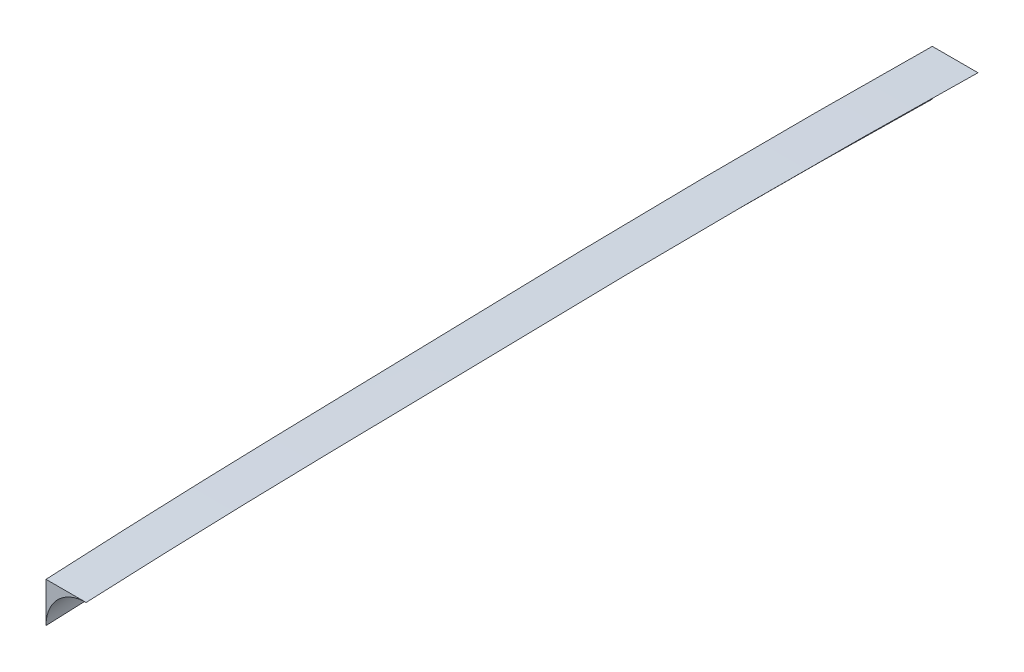
ISO-10303-21;
HEADER;
FILE_DESCRIPTION(('STEP AP214'),'2;1');
FILE_NAME('part.step','',(''),(''),'','','');
FILE_SCHEMA(('AUTOMOTIVE_DESIGN { 1 0 10303 214 1 1 1 1 }'));
ENDSEC;
DATA;
#1=APPLICATION_CONTEXT('core data for automotive mechanical design processes');
#2=APPLICATION_PROTOCOL_DEFINITION('international standard','automotive_design',2000,#1);
#3=PRODUCT_CONTEXT('',#1,'mechanical');
#4=PRODUCT('Part','Part','',(#3));
#5=PRODUCT_RELATED_PRODUCT_CATEGORY('part','',(#4));
#6=PRODUCT_DEFINITION_FORMATION('','',#4);
#7=PRODUCT_DEFINITION_CONTEXT('part definition',#1,'design');
#8=PRODUCT_DEFINITION('design','',#6,#7);
#9=PRODUCT_DEFINITION_SHAPE('','',#8);
#10=(LENGTH_UNIT() NAMED_UNIT(*) SI_UNIT(.MILLI.,.METRE.));
#11=(NAMED_UNIT(*) PLANE_ANGLE_UNIT() SI_UNIT($,.RADIAN.));
#12=(NAMED_UNIT(*) SI_UNIT($,.STERADIAN.) SOLID_ANGLE_UNIT());
#13=UNCERTAINTY_MEASURE_WITH_UNIT(LENGTH_MEASURE(1.E-05),#10,'distance_accuracy_value','');
#14=(GEOMETRIC_REPRESENTATION_CONTEXT(3) GLOBAL_UNCERTAINTY_ASSIGNED_CONTEXT((#13)) GLOBAL_UNIT_ASSIGNED_CONTEXT((#10,
#11,#12)) REPRESENTATION_CONTEXT('',''));
#15=CARTESIAN_POINT('',(0.,0.,0.));
#16=DIRECTION('',(0.,0.,1.));
#17=DIRECTION('',(1.,0.,0.));
#18=AXIS2_PLACEMENT_3D('',#15,#16,#17);
#19=CARTESIAN_POINT('',(536.645794558048,125.088293831377,1478.12000003458));
#20=DIRECTION('',(0.,0.,1.));
#21=DIRECTION('',(-1.,0.,0.));
#22=AXIS2_PLACEMENT_3D('',#19,#20,#21);
#23=PLANE('',#22);
#24=CARTESIAN_POINT('',(469.721789204401,192.012299185025,1478.12000003458));
#25=CARTESIAN_POINT('',(475.298789650539,192.012299185025,1478.12000003458));
#26=CARTESIAN_POINT('',(486.452790542813,192.012299185025,1478.12000003458));
#27=CARTESIAN_POINT('',(503.183791881225,192.012299185025,1478.12000003458));
#28=CARTESIAN_POINT('',(519.914793219637,192.012299185025,1478.12000003458));
#29=CARTESIAN_POINT('',(531.068794111911,192.012299185025,1478.12000003458));
#30=CARTESIAN_POINT('',(536.645794558048,192.012299185025,1478.12000003458));
#31=B_SPLINE_CURVE_WITH_KNOTS('',3,(#24,#25,#26,#27,#28,#29,#30),.UNSPECIFIED.,.F.,.F.,(4,1,1,1,
4),(0.719950423244221,0.789962817433166,0.859975211622111,0.929987605811055,1.),.UNSPECIFIED.);
#32=CARTESIAN_POINT('',(469.721789204401,192.012299185025,1478.12000003458));
#33=VERTEX_POINT('',#32);
#34=CARTESIAN_POINT('',(536.645794558048,192.012299185025,1478.12000003458));
#35=VERTEX_POINT('',#34);
#36=EDGE_CURVE('E173',#33,#35,#31,.T.);
#37=ORIENTED_EDGE('',*,*,#36,.F.);
#38=CARTESIAN_POINT('',(469.721789204401,125.088293831377,1478.12000003458));
#39=DIRECTION('',(0.,1.,0.));
#40=VECTOR('',#39,1.);
#41=LINE('',#38,#40);
#42=CARTESIAN_POINT('',(469.721789204401,125.088293831377,1478.12000003458));
#43=VERTEX_POINT('',#42);
#44=EDGE_CURVE('E12',#43,#33,#41,.T.);
#45=ORIENTED_EDGE('',*,*,#44,.F.);
#46=CARTESIAN_POINT('',(536.645794558048,192.012299185025,1478.12000003458));
#47=CARTESIAN_POINT('',(532.265628678885,192.012299185025,1478.12000003458));
#48=CARTESIAN_POINT('',(523.505401537646,191.149739728319,1478.12000003458));
#49=CARTESIAN_POINT('',(510.86993768225,187.316653797916,1478.12000003457));
#50=CARTESIAN_POINT('',(499.225054669449,181.092417477664,1478.12000003458));
#51=CARTESIAN_POINT('',(489.018240720654,172.715847668771,1478.12000003458));
#52=CARTESIAN_POINT('',(480.641670911763,162.509033719978,1478.12000003458));
#53=CARTESIAN_POINT('',(474.417434591509,150.864150707175,1478.12000003458));
#54=CARTESIAN_POINT('',(470.584348661108,138.228686851781,1478.12000003458));
#55=CARTESIAN_POINT('',(469.721789204401,129.46845971054,1478.12000003458));
#56=CARTESIAN_POINT('',(469.721789204401,125.088293831377,1478.12000003458));
#57=B_SPLINE_CURVE_WITH_KNOTS('',3,(#46,#47,#48,#49,#50,#51,#52,#53,#54,#55,#56),.UNSPECIFIED.,
.F.,.F.,(4,1,1,1,1,1,1,1,4),(0.,0.0549876058110553,0.109975211622111,0.164962817433166,
0.219950423244221,0.274938029055277,0.329925634866332,0.384913240677387,0.439900846488443),.UNSPECIFIED.);
#58=EDGE_CURVE('E70',#35,#43,#57,.T.);
#59=ORIENTED_EDGE('',*,*,#58,.F.);
#60=EDGE_LOOP('',(#37,#45,#59));
#61=FACE_BOUND('',#60,.T.);
#62=ADVANCED_FACE('F59',(#61),#23,.T.);
#63=CARTESIAN_POINT('',(545.921789204401,146.514247855733,0.));
#64=DIRECTION('',(0.,0.,-1.));
#65=DIRECTION('',(1.,0.,0.));
#66=AXIS2_PLACEMENT_3D('',#63,#64,#65);
#67=PLANE('',#66);
#68=CARTESIAN_POINT('',(469.721789204401,146.514247855734,0.));
#69=CARTESIAN_POINT('',(469.721789204401,151.501526160857,0.));
#70=CARTESIAN_POINT('',(470.703903622893,161.475963653578,0.));
#71=CARTESIAN_POINT('',(475.068274021124,175.862764633185,0.));
#72=CARTESIAN_POINT('',(482.155219954757,189.121685417836,0.));
#73=CARTESIAN_POINT('',(491.692823331371,200.743213728763,0.));
#74=CARTESIAN_POINT('',(503.3143516423,210.280817105379,0.));
#75=CARTESIAN_POINT('',(516.57327242695,217.367763039009,0.));
#76=CARTESIAN_POINT('',(530.960073406556,221.732133437242,0.));
#77=CARTESIAN_POINT('',(540.934510899278,222.714247855734,0.));
#78=CARTESIAN_POINT('',(545.921789204401,222.714247855734,0.));
#79=B_SPLINE_CURVE_WITH_KNOTS('',3,(#68,#69,#70,#71,#72,#73,#74,#75,#76,#77,#78),.UNSPECIFIED.,
.F.,.F.,(4,1,1,1,1,1,1,1,4),(0.,0.0549876058110552,0.109975211622111,0.164962817433166,
0.219950423244221,0.274938029055277,0.329925634866332,0.384913240677387,0.439900846488443),.UNSPECIFIED.);
#80=CARTESIAN_POINT('',(469.721789204401,146.514247855733,0.));
#81=VERTEX_POINT('',#80);
#82=CARTESIAN_POINT('',(545.921789204401,222.714247855733,0.));
#83=VERTEX_POINT('',#82);
#84=EDGE_CURVE('E112',#81,#83,#79,.T.);
#85=ORIENTED_EDGE('',*,*,#84,.F.);
#86=CARTESIAN_POINT('',(469.721789204401,222.714247855733,0.));
#87=DIRECTION('',(0.,-1.,0.));
#88=VECTOR('',#87,1.);
#89=LINE('',#86,#88);
#90=CARTESIAN_POINT('',(469.721789204401,222.714247855733,0.));
#91=VERTEX_POINT('',#90);
#92=EDGE_CURVE('E95',#91,#81,#89,.T.);
#93=ORIENTED_EDGE('',*,*,#92,.F.);
#94=CARTESIAN_POINT('',(545.921789204401,222.714247855734,0.));
#95=CARTESIAN_POINT('',(539.571789204401,222.714247855733,0.));
#96=CARTESIAN_POINT('',(526.871789204402,222.714247855733,0.));
#97=CARTESIAN_POINT('',(507.8217892044,222.714247855734,0.));
#98=CARTESIAN_POINT('',(488.771789204402,222.714247855733,0.));
#99=CARTESIAN_POINT('',(476.071789204401,222.714247855733,0.));
#100=CARTESIAN_POINT('',(469.721789204401,222.714247855733,0.));
#101=B_SPLINE_CURVE_WITH_KNOTS('',3,(#94,#95,#96,#97,#98,#99,#100),.UNSPECIFIED.,.F.,.F.,(4,1,1,
1,4),(0.719950423244221,0.789962817433166,0.859975211622111,0.929987605811055,1.),.UNSPECIFIED.);
#102=EDGE_CURVE('E103',#83,#91,#101,.T.);
#103=ORIENTED_EDGE('',*,*,#102,.F.);
#104=EDGE_LOOP('',(#85,#93,#103));
#105=FACE_BOUND('',#104,.T.);
#106=ADVANCED_FACE('F111',(#105),#67,.T.);
#107=CARTESIAN_POINT('',(469.721789204401,222.714247855733,0.));
#108=CARTESIAN_POINT('',(469.721789204401,223.250393289315,39.964111836307));
#109=CARTESIAN_POINT('',(469.721789204401,223.877067278874,104.420155124772));
#110=CARTESIAN_POINT('',(469.721789204401,224.323472801892,210.525069486874));
#111=CARTESIAN_POINT('',(469.721789204401,224.146375677718,305.191546115832));
#112=CARTESIAN_POINT('',(469.721789204401,223.43436307838,394.789705875396));
#113=CARTESIAN_POINT('',(469.721789204401,222.58870705541,464.532982866826));
#114=CARTESIAN_POINT('',(469.721789204401,221.479454929101,534.202341779117));
#115=CARTESIAN_POINT('',(469.721789204401,220.123152326283,601.600090763413));
#116=CARTESIAN_POINT('',(469.721789204401,219.00813066391,647.56138222553));
#117=CARTESIAN_POINT('',(469.7217892044,214.748999567608,810.211036736476));
#118=CARTESIAN_POINT('',(469.7217892044,211.107532041842,949.273071124735));
#119=CARTESIAN_POINT('',(469.721789204401,206.746151266315,1115.82748334902));
#120=CARTESIAN_POINT('',(469.721789204401,205.186407442081,1169.8284689647));
#121=CARTESIAN_POINT('',(469.721789204401,202.431481829042,1249.5666113323));
#122=CARTESIAN_POINT('',(469.721789204401,199.146712327731,1331.11260801738));
#123=CARTESIAN_POINT('',(469.721789204401,195.646698573,1407.81553559688));
#124=CARTESIAN_POINT('',(469.721789204401,193.188798117387,1456.17907159136));
#125=CARTESIAN_POINT('',(469.721789204401,192.012299185025,1478.12000003458));
#126=CARTESIAN_POINT('',(476.071789204401,222.714247855733,0.));
#127=CARTESIAN_POINT('',(476.050733530523,223.250393289315,39.964111836307));
#128=CARTESIAN_POINT('',(476.017552718902,223.877067278874,104.420155124772));
#129=CARTESIAN_POINT('',(475.960121631796,224.323472801892,210.525069486874));
#130=CARTESIAN_POINT('',(475.911621080826,224.146375677718,305.191546115832));
#131=CARTESIAN_POINT('',(475.863120529856,223.43436307838,394.789705875396));
#132=CARTESIAN_POINT('',(475.826745116628,222.58870705541,464.532982866826));
#133=CARTESIAN_POINT('',(475.7903697034,221.479454929101,534.202341779117));
#134=CARTESIAN_POINT('',(475.753994290173,220.123152326283,601.600090763414));
#135=CARTESIAN_POINT('',(475.729744014688,219.00813066391,647.56138222553));
#136=CARTESIAN_POINT('',(475.646134500269,214.748999567608,810.211036736477));
#137=CARTESIAN_POINT('',(475.574650123594,211.107532041842,949.273071124736));
#138=CARTESIAN_POINT('',(475.48903338145,206.746151266315,1115.82748334902));
#139=CARTESIAN_POINT('',(475.460768650511,205.186407442081,1169.8284689647));
#140=CARTESIAN_POINT('',(475.418371554102,202.431481829042,1249.5666113323));
#141=CARTESIAN_POINT('',(475.375974457693,199.146712327731,1331.11260801738));
#142=CARTESIAN_POINT('',(475.336113823172,195.646698573,1407.81553559688));
#143=CARTESIAN_POINT('',(475.310385554121,193.188798117387,1456.17907159136));
#144=CARTESIAN_POINT('',(475.298789650539,192.012299185025,1478.12000003458));
#145=CARTESIAN_POINT('',(488.771789204402,222.714247855733,0.));
#146=CARTESIAN_POINT('',(488.708622182767,223.250393289315,39.964111836307));
#147=CARTESIAN_POINT('',(488.609079747905,223.877067278874,104.420155124772));
#148=CARTESIAN_POINT('',(488.436786486587,224.323472801892,210.525069486875));
#149=CARTESIAN_POINT('',(488.291284833676,224.146375677717,305.191546115832));
#150=CARTESIAN_POINT('',(488.145783180766,223.43436307838,394.789705875396));
#151=CARTESIAN_POINT('',(488.036656941082,222.58870705541,464.532982866826));
#152=CARTESIAN_POINT('',(487.927530701399,221.479454929101,534.202341779117));
#153=CARTESIAN_POINT('',(487.818404461716,220.123152326283,601.600090763414));
#154=CARTESIAN_POINT('',(487.745653635261,219.00813066391,647.561382225531));
#155=CARTESIAN_POINT('',(487.494825092006,214.748999567608,810.211036736477));
#156=CARTESIAN_POINT('',(487.280371961982,211.107532041841,949.273071124736));
#157=CARTESIAN_POINT('',(487.023521735548,206.746151266315,1115.82748334902));
#158=CARTESIAN_POINT('',(486.93872754273,205.186407442081,1169.82846896471));
#159=CARTESIAN_POINT('',(486.811536253504,202.431481829042,1249.5666113323));
#160=CARTESIAN_POINT('',(486.684344964277,199.146712327731,1331.11260801738));
#161=CARTESIAN_POINT('',(486.564763060714,195.646698573,1407.81553559688));
#162=CARTESIAN_POINT('',(486.487578253559,193.188798117387,1456.17907159137));
#163=CARTESIAN_POINT('',(486.452790542813,192.012299185025,1478.12000003458));
#164=CARTESIAN_POINT('',(507.8217892044,222.714247855734,0.));
#165=CARTESIAN_POINT('',(507.69545516113,223.250393289315,39.964111836307));
#166=CARTESIAN_POINT('',(507.496370291406,223.877067278875,104.420155124772));
#167=CARTESIAN_POINT('',(507.15178376877,224.323472801892,210.525069486874));
#168=CARTESIAN_POINT('',(506.860780462948,224.146375677718,305.191546115832));
#169=CARTESIAN_POINT('',(506.569777157128,223.43436307838,394.789705875396));
#170=CARTESIAN_POINT('',(506.351524677761,222.58870705541,464.532982866826));
#171=CARTESIAN_POINT('',(506.133272198395,221.479454929101,534.202341779117));
#172=CARTESIAN_POINT('',(505.915019719029,220.123152326283,601.600090763413));
#173=CARTESIAN_POINT('',(505.769518066118,219.00813066391,647.56138222553));
#174=CARTESIAN_POINT('',(505.267860979611,214.748999567608,810.211036736476));
#175=CARTESIAN_POINT('',(504.838954719562,211.107532041842,949.273071124735));
#176=CARTESIAN_POINT('',(504.325254266695,206.746151266315,1115.82748334902));
#177=CARTESIAN_POINT('',(504.155665881059,205.186407442081,1169.8284689647));
#178=CARTESIAN_POINT('',(503.901283302606,202.431481829042,1249.5666113323));
#179=CARTESIAN_POINT('',(503.646900724153,199.146712327731,1331.11260801738));
#180=CARTESIAN_POINT('',(503.407736917026,195.646698573,1407.81553559688));
#181=CARTESIAN_POINT('',(503.253367302717,193.188798117387,1456.17907159136));
#182=CARTESIAN_POINT('',(503.183791881225,192.012299185025,1478.12000003458));
#183=CARTESIAN_POINT('',(526.871789204402,222.714247855733,0.));
#184=CARTESIAN_POINT('',(526.682288139497,223.250393289315,39.964111836307));
#185=CARTESIAN_POINT('',(526.38366083491,223.877067278874,104.420155124772));
#186=CARTESIAN_POINT('',(525.866781050956,224.323472801892,210.525069486874));
#187=CARTESIAN_POINT('',(525.430276092224,224.146375677717,305.191546115832));
#188=CARTESIAN_POINT('',(524.993771133492,223.43436307838,394.789705875396));
#189=CARTESIAN_POINT('',(524.666392414442,222.58870705541,464.532982866826));
#190=CARTESIAN_POINT('',(524.339013695393,221.479454929101,534.202341779117));
#191=CARTESIAN_POINT('',(524.011634976344,220.123152326283,601.600090763414));
#192=CARTESIAN_POINT('',(523.793382496978,219.00813066391,647.56138222553));
#193=CARTESIAN_POINT('',(523.040896867218,214.748999567608,810.211036736477));
#194=CARTESIAN_POINT('',(522.397537477143,211.107532041841,949.273071124736));
#195=CARTESIAN_POINT('',(521.626986797842,206.746151266315,1115.82748334902));
#196=CARTESIAN_POINT('',(521.372604219388,205.186407442081,1169.8284689647));
#197=CARTESIAN_POINT('',(520.991030351708,202.431481829042,1249.5666113323));
#198=CARTESIAN_POINT('',(520.609456484029,199.146712327731,1331.11260801738));
#199=CARTESIAN_POINT('',(520.250710773338,195.646698573,1407.81553559688));
#200=CARTESIAN_POINT('',(520.019156351874,193.188798117387,1456.17907159137));
#201=CARTESIAN_POINT('',(519.914793219637,192.012299185025,1478.12000003458));
#202=CARTESIAN_POINT('',(539.571789204401,222.714247855733,0.));
#203=CARTESIAN_POINT('',(539.34017679174,223.250393289315,39.964111836307));
#204=CARTESIAN_POINT('',(538.975187863911,223.877067278874,104.420155124772));
#205=CARTESIAN_POINT('',(538.343445905746,224.323472801892,210.525069486874));
#206=CARTESIAN_POINT('',(537.809939845073,224.146375677718,305.191546115832));
#207=CARTESIAN_POINT('',(537.276433784401,223.43436307838,394.789705875396));
#208=CARTESIAN_POINT('',(536.876304238896,222.58870705541,464.532982866826));
#209=CARTESIAN_POINT('',(536.476174693391,221.479454929101,534.202341779117));
#210=CARTESIAN_POINT('',(536.076045147886,220.123152326283,601.600090763414));
#211=CARTESIAN_POINT('',(535.80929211755,219.00813066391,647.56138222553));
#212=CARTESIAN_POINT('',(534.889587458955,214.748999567608,810.211036736477));
#213=CARTESIAN_POINT('',(534.10325931553,211.107532041842,949.273071124736));
#214=CARTESIAN_POINT('',(533.161475151939,206.746151266315,1115.82748334902));
#215=CARTESIAN_POINT('',(532.850563111608,205.186407442081,1169.8284689647));
#216=CARTESIAN_POINT('',(532.38419505111,202.431481829042,1249.5666113323));
#217=CARTESIAN_POINT('',(531.917826990613,199.146712327731,1331.11260801738));
#218=CARTESIAN_POINT('',(531.47936001088,195.646698573,1407.81553559688));
#219=CARTESIAN_POINT('',(531.196349051312,193.188798117387,1456.17907159136));
#220=CARTESIAN_POINT('',(531.068794111911,192.012299185025,1478.12000003458));
#221=CARTESIAN_POINT('',(545.921789204401,222.714247855734,0.));
#222=CARTESIAN_POINT('',(545.669121117862,223.250393289315,39.964111836307));
#223=CARTESIAN_POINT('',(545.270951378412,223.877067278874,104.420155124772));
#224=CARTESIAN_POINT('',(544.581778333141,224.323472801892,210.525069486874));
#225=CARTESIAN_POINT('',(543.999771721497,224.146375677718,305.191546115832));
#226=CARTESIAN_POINT('',(543.417765109855,223.43436307838,394.789705875396));
#227=CARTESIAN_POINT('',(542.981260151122,222.58870705541,464.532982866826));
#228=CARTESIAN_POINT('',(542.54475519239,221.479454929101,534.202341779117));
#229=CARTESIAN_POINT('',(542.108250233658,220.123152326283,601.600090763413));
#230=CARTESIAN_POINT('',(541.817246927836,219.00813066391,647.56138222553));
#231=CARTESIAN_POINT('',(540.813932754824,214.748999567608,810.211036736476));
#232=CARTESIAN_POINT('',(539.956120234724,211.107532041842,949.273071124735));
#233=CARTESIAN_POINT('',(538.928719328988,206.746151266315,1115.82748334902));
#234=CARTESIAN_POINT('',(538.589542557717,205.186407442081,1169.8284689647));
#235=CARTESIAN_POINT('',(538.080777400811,202.431481829042,1249.5666113323));
#236=CARTESIAN_POINT('',(537.572012243904,199.146712327731,1331.11260801738));
#237=CARTESIAN_POINT('',(537.09368462965,195.646698573,1407.81553559688));
#238=CARTESIAN_POINT('',(536.784945401031,193.188798117387,1456.17907159136));
#239=CARTESIAN_POINT('',(536.645794558048,192.012299185025,1478.12000003458));
#240=B_SPLINE_SURFACE_WITH_KNOTS('',3,3,((#107,#108,#109,#110,#111,#112,#113,#114,#115,#116,
#117,#118,#119,#120,#121,#122,#123,#124,#125),(#126,#127,#128,#129,#130,#131,#132,#133,#134,
#135,#136,#137,#138,#139,#140,#141,#142,#143,#144),(#145,#146,#147,#148,#149,#150,#151,#152,
#153,#154,#155,#156,#157,#158,#159,#160,#161,#162,#163),(#164,#165,#166,#167,#168,#169,#170,
#171,#172,#173,#174,#175,#176,#177,#178,#179,#180,#181,#182),(#183,#184,#185,#186,#187,#188,
#189,#190,#191,#192,#193,#194,#195,#196,#197,#198,#199,#200,#201),(#202,#203,#204,#205,#206,
#207,#208,#209,#210,#211,#212,#213,#214,#215,#216,#217,#218,#219,#220),(#221,#222,#223,#224,
#225,#226,#227,#228,#229,#230,#231,#232,#233,#234,#235,#236,#237,#238,#239)),.UNSPECIFIED.,.F.,
.F.,.F.,(4,1,1,1,4),(4,1,1,1,1,1,1,1,2,2,1,1,1,1,4),(0.719950423244221,0.789962817433166,
0.859975211622111,0.929987605811055,1.),(0.,0.0817167633786319,0.128774246201127,
0.222889211846116,0.269946694668611,0.317004177491106,0.3640616603136,0.411119143136095,
0.45817662595859,0.735606449757969,0.790453954128459,0.845301458498948,0.900148962869438,
0.954996467239928,1.),.UNSPECIFIED.);
#241=CARTESIAN_POINT('',(469.721789204401,222.714247855733,0.));
#242=CARTESIAN_POINT('',(469.721789204401,223.250393289315,39.964111836307));
#243=CARTESIAN_POINT('',(469.721789204401,223.877067278874,104.420155124772));
#244=CARTESIAN_POINT('',(469.721789204401,224.323472801892,210.525069486874));
#245=CARTESIAN_POINT('',(469.721789204401,224.146375677718,305.191546115832));
#246=CARTESIAN_POINT('',(469.721789204401,223.43436307838,394.789705875396));
#247=CARTESIAN_POINT('',(469.721789204401,222.58870705541,464.532982866826));
#248=CARTESIAN_POINT('',(469.721789204401,221.479454929101,534.202341779117));
#249=CARTESIAN_POINT('',(469.721789204401,220.123152326283,601.600090763413));
#250=CARTESIAN_POINT('',(469.721789204401,219.00813066391,647.56138222553));
#251=CARTESIAN_POINT('',(469.7217892044,214.748999567608,810.211036736476));
#252=CARTESIAN_POINT('',(469.7217892044,211.107532041842,949.273071124735));
#253=CARTESIAN_POINT('',(469.721789204401,206.746151266315,1115.82748334902));
#254=CARTESIAN_POINT('',(469.721789204401,205.186407442081,1169.8284689647));
#255=CARTESIAN_POINT('',(469.721789204401,202.431481829042,1249.5666113323));
#256=CARTESIAN_POINT('',(469.721789204401,199.146712327731,1331.11260801738));
#257=CARTESIAN_POINT('',(469.721789204401,195.646698573,1407.81553559688));
#258=CARTESIAN_POINT('',(469.721789204401,193.188798117387,1456.17907159136));
#259=CARTESIAN_POINT('',(469.721789204401,192.012299185025,1478.12000003458));
#260=B_SPLINE_CURVE_WITH_KNOTS('',3,(#241,#242,#243,#244,#245,#246,#247,#248,#249,#250,#251,
#252,#253,#254,#255,#256,#257,#258,#259),.UNSPECIFIED.,.F.,.F.,(4,1,1,1,1,1,1,1,2,2,1,1,1,1,4),
(0.,0.0817167633786319,0.128774246201127,0.222889211846116,0.269946694668611,0.317004177491106,
0.3640616603136,0.411119143136095,0.45817662595859,0.735606449757969,0.790453954128459,
0.845301458498948,0.900148962869438,0.954996467239928,1.),.UNSPECIFIED.);
#261=EDGE_CURVE('E84',#91,#33,#260,.T.);
#262=CARTESIAN_POINT('',(545.921789204401,222.714247855734,0.));
#263=CARTESIAN_POINT('',(545.669121117862,223.250393289315,39.964111836307));
#264=CARTESIAN_POINT('',(545.270951378412,223.877067278874,104.420155124772));
#265=CARTESIAN_POINT('',(544.581778333141,224.323472801892,210.525069486874));
#266=CARTESIAN_POINT('',(543.999771721497,224.146375677718,305.191546115832));
#267=CARTESIAN_POINT('',(543.417765109855,223.43436307838,394.789705875396));
#268=CARTESIAN_POINT('',(542.981260151122,222.58870705541,464.532982866826));
#269=CARTESIAN_POINT('',(542.54475519239,221.479454929101,534.202341779117));
#270=CARTESIAN_POINT('',(542.108250233658,220.123152326283,601.600090763413));
#271=CARTESIAN_POINT('',(541.817246927836,219.00813066391,647.56138222553));
#272=CARTESIAN_POINT('',(540.813932754824,214.748999567608,810.211036736476));
#273=CARTESIAN_POINT('',(539.956120234724,211.107532041842,949.273071124735));
#274=CARTESIAN_POINT('',(538.928719328988,206.746151266315,1115.82748334902));
#275=CARTESIAN_POINT('',(538.589542557717,205.186407442081,1169.8284689647));
#276=CARTESIAN_POINT('',(538.080777400811,202.431481829042,1249.5666113323));
#277=CARTESIAN_POINT('',(537.572012243904,199.146712327731,1331.11260801738));
#278=CARTESIAN_POINT('',(537.09368462965,195.646698573,1407.81553559688));
#279=CARTESIAN_POINT('',(536.784945401031,193.188798117387,1456.17907159136));
#280=CARTESIAN_POINT('',(536.645794558048,192.012299185025,1478.12000003458));
#281=B_SPLINE_CURVE_WITH_KNOTS('',3,(#262,#263,#264,#265,#266,#267,#268,#269,#270,#271,#272,
#273,#274,#275,#276,#277,#278,#279,#280),.UNSPECIFIED.,.F.,.F.,(4,1,1,1,1,1,1,1,2,2,1,1,1,1,4),
(0.,0.0817167633786319,0.128774246201127,0.222889211846116,0.269946694668611,0.317004177491106,
0.3640616603136,0.411119143136095,0.45817662595859,0.735606449757969,0.790453954128459,
0.845301458498948,0.900148962869438,0.954996467239928,1.),.UNSPECIFIED.);
#282=EDGE_CURVE('E100',#83,#35,#281,.T.);
#283=ORIENTED_EDGE('',*,*,#102,.T.);
#284=ORIENTED_EDGE('',*,*,#261,.T.);
#285=ORIENTED_EDGE('',*,*,#36,.T.);
#286=ORIENTED_EDGE('',*,*,#282,.F.);
#287=EDGE_LOOP('',(#283,#284,#285,#286));
#288=FACE_BOUND('',#287,.T.);
#289=ADVANCED_FACE('F105',(#288),#240,.F.);
#290=CARTESIAN_POINT('',(469.721789204401,146.514247855734,0.));
#291=DIRECTION('',(-1.,0.,0.));
#292=DIRECTION('',(0.,1.,0.));
#293=AXIS2_PLACEMENT_3D('',#290,#291,#292);
#294=PLANE('',#293);
#295=ORIENTED_EDGE('',*,*,#92,.T.);
#296=CARTESIAN_POINT('',(469.721789204401,146.514247855734,0.));
#297=CARTESIAN_POINT('',(469.721789204401,147.303061375854,39.964111836307));
#298=CARTESIAN_POINT('',(469.721789204401,148.327905104864,104.420155124772));
#299=CARTESIAN_POINT('',(469.721789204401,149.463483673153,210.525069486874));
#300=CARTESIAN_POINT('',(469.721789204401,149.868393160621,305.191546115832));
#301=CARTESIAN_POINT('',(469.721789204401,149.738387172927,394.789705875396));
#302=CARTESIAN_POINT('',(469.721789204401,149.329236108689,464.532982866826));
#303=CARTESIAN_POINT('',(469.721789204401,148.656488941112,534.202341779117));
#304=CARTESIAN_POINT('',(469.721789204401,147.736691297027,601.600090763413));
#305=CARTESIAN_POINT('',(469.721789204401,146.912672940475,647.56138222553));
#306=CARTESIAN_POINT('',(469.7217892044,143.656856017185,810.211036736476));
#307=CARTESIAN_POINT('',(469.7217892044,140.873201011518,949.273071124735));
#308=CARTESIAN_POINT('',(469.721789204401,137.539221141728,1115.82748334902));
#309=CARTESIAN_POINT('',(469.721789204401,136.318654088765,1169.8284689647));
#310=CARTESIAN_POINT('',(469.721789204401,134.072493632632,1249.5666113323));
#311=CARTESIAN_POINT('',(469.721789204401,131.296489288227,1331.11260801738));
#312=CARTESIAN_POINT('',(469.721789204401,128.274803147751,1407.81553559688));
#313=CARTESIAN_POINT('',(469.721789204401,126.125641920756,1456.17907159136));
#314=CARTESIAN_POINT('',(469.721789204401,125.088293831377,1478.12000003458));
#315=B_SPLINE_CURVE_WITH_KNOTS('',3,(#296,#297,#298,#299,#300,#301,#302,#303,#304,#305,#306,
#307,#308,#309,#310,#311,#312,#313,#314),.UNSPECIFIED.,.F.,.F.,(4,1,1,1,1,1,1,1,2,2,1,1,1,1,4),
(0.,0.0817167633786319,0.128774246201127,0.222889211846116,0.269946694668611,0.317004177491106,
0.3640616603136,0.411119143136095,0.45817662595859,0.735606449757969,0.790453954128459,
0.845301458498948,0.900148962869438,0.954996467239928,1.),.UNSPECIFIED.);
#316=EDGE_CURVE('E76',#81,#43,#315,.T.);
#317=ORIENTED_EDGE('',*,*,#316,.T.);
#318=ORIENTED_EDGE('',*,*,#44,.T.);
#319=ORIENTED_EDGE('',*,*,#261,.F.);
#320=EDGE_LOOP('',(#295,#317,#318,#319));
#321=FACE_BOUND('',#320,.T.);
#322=ADVANCED_FACE('F61',(#321),#294,.T.);
#323=CARTESIAN_POINT('',(545.921789204401,222.714247855734,0.));
#324=CARTESIAN_POINT('',(545.669121117862,223.250393289315,39.964111836307));
#325=CARTESIAN_POINT('',(545.270951378412,223.877067278874,104.420155124772));
#326=CARTESIAN_POINT('',(544.581778333141,224.323472801892,210.525069486874));
#327=CARTESIAN_POINT('',(543.999771721497,224.146375677718,305.191546115832));
#328=CARTESIAN_POINT('',(543.417765109855,223.43436307838,394.789705875396));
#329=CARTESIAN_POINT('',(542.981260151122,222.58870705541,464.532982866826));
#330=CARTESIAN_POINT('',(542.54475519239,221.479454929101,534.202341779117));
#331=CARTESIAN_POINT('',(542.108250233658,220.123152326283,601.600090763413));
#332=CARTESIAN_POINT('',(541.817246927836,219.00813066391,647.56138222553));
#333=CARTESIAN_POINT('',(540.813932754824,214.748999567608,810.211036736476));
#334=CARTESIAN_POINT('',(539.956120234724,211.107532041842,949.273071124735));
#335=CARTESIAN_POINT('',(538.928719328988,206.746151266315,1115.82748334902));
#336=CARTESIAN_POINT('',(538.589542557717,205.186407442081,1169.8284689647));
#337=CARTESIAN_POINT('',(538.080777400811,202.431481829042,1249.5666113323));
#338=CARTESIAN_POINT('',(537.572012243904,199.146712327731,1331.11260801738));
#339=CARTESIAN_POINT('',(537.09368462965,195.646698573,1407.81553559688));
#340=CARTESIAN_POINT('',(536.784945401031,193.188798117387,1456.17907159136));
#341=CARTESIAN_POINT('',(536.645794558048,192.012299185025,1478.12000003458));
#342=CARTESIAN_POINT('',(540.934510899278,222.714247855734,0.));
#343=CARTESIAN_POINT('',(540.698379900224,223.250393289315,39.964111836307));
#344=CARTESIAN_POINT('',(540.326270309112,223.877067278874,104.420155124772));
#345=CARTESIAN_POINT('',(539.682203533881,224.323472801892,210.525069486874));
#346=CARTESIAN_POINT('',(539.138289165646,224.146375677718,305.191546115832));
#347=CARTESIAN_POINT('',(538.594374797412,223.43436307838,394.789705875396));
#348=CARTESIAN_POINT('',(538.186439021235,222.58870705541,464.532982866826));
#349=CARTESIAN_POINT('',(537.778503245059,221.479454929101,534.202341779117));
#350=CARTESIAN_POINT('',(537.370567468882,220.123152326283,601.600090763413));
#351=CARTESIAN_POINT('',(537.098610284765,219.00813066391,647.56138222553));
#352=CARTESIAN_POINT('',(536.160962870391,214.748999567608,810.211036736476));
#353=CARTESIAN_POINT('',(535.359294048078,211.107532041842,949.273071124735));
#354=CARTESIAN_POINT('',(534.399136373942,206.746151266315,1115.82748334902));
#355=CARTESIAN_POINT('',(534.082158670295,205.186407442081,1169.8284689647));
#356=CARTESIAN_POINT('',(533.606692114824,202.431481829042,1249.5666113323));
#357=CARTESIAN_POINT('',(533.131225559354,199.146712327731,1331.11260801738));
#358=CARTESIAN_POINT('',(532.684204414041,195.646698573,1407.81553559688));
#359=CARTESIAN_POINT('',(532.395672120552,193.188798117387,1456.17907159136));
#360=CARTESIAN_POINT('',(532.265628678885,192.012299185025,1478.12000003458));
#361=CARTESIAN_POINT('',(530.960073406556,221.732133437242,0.));
#362=CARTESIAN_POINT('',(530.757016187497,222.271535418998,39.9641118363071));
#363=CARTESIAN_POINT('',(530.437026270632,222.903341275252,104.420155124772));
#364=CARTESIAN_POINT('',(529.883170958154,223.358629302005,210.525069486875));
#365=CARTESIAN_POINT('',(529.41544016693,223.189033451911,305.191546115832));
#366=CARTESIAN_POINT('',(528.947709375705,222.484522126654,394.789705875397));
#367=CARTESIAN_POINT('',(528.596911282286,221.644492059244,464.532982866827));
#368=CARTESIAN_POINT('',(528.246113188868,220.540865888496,534.202341779118));
#369=CARTESIAN_POINT('',(527.895315095449,219.190189241239,601.600090763415));
#370=CARTESIAN_POINT('',(527.661449699837,218.078918215906,647.561382225531));
#371=CARTESIAN_POINT('',(526.855134234338,213.832718475452,810.211036736478));
#372=CARTESIAN_POINT('',(526.165751466647,210.202306987013,949.273071124737));
#373=CARTESIAN_POINT('',(525.340078649653,205.854168012577,1115.82748334902));
#374=CARTESIAN_POINT('',(525.067498551046,204.298795715869,1169.82846896471));
#375=CARTESIAN_POINT('',(524.658628403135,201.550427394118,1249.5666113323));
#376=CARTESIAN_POINT('',(524.249758255225,198.272215184096,1331.11260801738));
#377=CARTESIAN_POINT('',(523.865349300062,194.778366422105,1407.81553559688));
#378=CARTESIAN_POINT('',(523.617230394202,192.324445195468,1456.17907159137));
#379=CARTESIAN_POINT('',(523.505401537646,191.149739728319,1478.12000003458));
#380=CARTESIAN_POINT('',(516.57327242695,217.367763039009,0.));
#381=CARTESIAN_POINT('',(516.417919741683,217.92163663648,39.9641118363069));
#382=CARTESIAN_POINT('',(516.173105530823,218.576247745021,104.420155124772));
#383=CARTESIAN_POINT('',(515.749368268775,219.071008297208,210.525069486874));
#384=CARTESIAN_POINT('',(515.391522166402,218.934746993405,305.191546115831));
#385=CARTESIAN_POINT('',(515.03367606403,218.26357021444,394.789705875395));
#386=CARTESIAN_POINT('',(514.76529148725,217.44854105675,464.532982866825));
#387=CARTESIAN_POINT('',(514.49690691047,216.36991579572,534.202341779116));
#388=CARTESIAN_POINT('',(514.228522333691,215.044240058182,601.600090763412));
#389=CARTESIAN_POINT('',(514.049599282504,213.949636305995,647.561382225529));
#390=CARTESIAN_POINT('',(513.432712705813,209.760901587546,810.211036736475));
#391=CARTESIAN_POINT('',(512.905287654716,206.179621484539,949.273071124733));
#392=CARTESIAN_POINT('',(512.273591377841,201.890327104593,1115.82748334902));
#393=CARTESIAN_POINT('',(512.065048926283,200.354381225999,1169.8284689647));
#394=CARTESIAN_POINT('',(511.752235248947,197.63515253142,1249.56661133229));
#395=CARTESIAN_POINT('',(511.439421571611,194.386079948569,1331.11260801738));
#396=CARTESIAN_POINT('',(511.145322382712,190.919627497343,1407.81553559688));
#397=CARTESIAN_POINT('',(510.955494419591,188.483389372414,1456.17907159136));
#398=CARTESIAN_POINT('',(510.86993768225,187.316653797916,1478.12000003457));
#399=CARTESIAN_POINT('',(503.3143516423,210.280817105379,0.));
#400=CARTESIAN_POINT('',(503.202963604594,210.858189981964,39.964111836307));
#401=CARTESIAN_POINT('',(503.027431559537,211.54983268389,104.420155124772));
#402=CARTESIAN_POINT('',(502.723611499776,212.108689458002,210.525069486874));
#403=CARTESIAN_POINT('',(502.467035470368,212.026557411283,305.191546115832));
#404=CARTESIAN_POINT('',(502.210459440961,211.409509889401,394.789705875396));
#405=CARTESIAN_POINT('',(502.018027418904,210.635077674522,464.532982866826));
#406=CARTESIAN_POINT('',(501.825595396848,209.597049356305,534.202341779117));
#407=CARTESIAN_POINT('',(501.633163374792,208.311970561579,601.600090763413));
#408=CARTESIAN_POINT('',(501.504875360088,207.244431437934,647.56138222553));
#409=CARTESIAN_POINT('',(501.062567039855,203.149009492432,810.211036736476));
#410=CARTESIAN_POINT('',(500.684402726975,199.647509848102,949.273071124735));
#411=CARTESIAN_POINT('',(500.231475836231,195.453768416595,1115.82748334902));
#412=CARTESIAN_POINT('',(500.081950680504,193.949367517528,1169.8284689647));
#413=CARTESIAN_POINT('',(499.857662946914,191.277456292239,1249.5666113323));
#414=CARTESIAN_POINT('',(499.633375213323,188.075701178679,1331.11260801738));
#415=CARTESIAN_POINT('',(499.422505787502,184.653735367095,1407.81553559688));
#416=CARTESIAN_POINT('',(499.286398939544,182.246211392045,1456.17907159136));
#417=CARTESIAN_POINT('',(499.225054669449,181.092417477664,1478.12000003458));
#418=CARTESIAN_POINT('',(491.692823331371,200.743213728763,0.));
#419=CARTESIAN_POINT('',(491.619970586591,201.352211907124,39.9641118363071));
#420=CARTESIAN_POINT('',(491.505164800059,202.093691683215,104.420155124772));
#421=CARTESIAN_POINT('',(491.306452930019,202.738809076273,210.525069486875));
#422=CARTESIAN_POINT('',(491.138640763004,202.729524119113,305.191546115832));
#423=CARTESIAN_POINT('',(490.97082859599,202.185323686791,394.789705875397));
#424=CARTESIAN_POINT('',(490.844969470728,201.465526789082,464.532982866827));
#425=CARTESIAN_POINT('',(490.719110345467,200.482133788034,534.202341779118));
#426=CARTESIAN_POINT('',(490.593251220206,199.251690310477,601.600090763414));
#427=CARTESIAN_POINT('',(490.509345136699,198.220574731612,647.561382225531));
#428=CARTESIAN_POINT('',(490.220055767467,194.25073300454,810.211036736477));
#429=CARTESIAN_POINT('',(489.972719439992,190.856601806249,949.273071124736));
#430=CARTESIAN_POINT('',(489.67648505204,186.791455418675,1115.82748334902));
#431=CARTESIAN_POINT('',(489.578688931086,185.329507715395,1169.82846896471));
#432=CARTESIAN_POINT('',(489.431994749655,182.721276283786,1249.5666113323));
#433=CARTESIAN_POINT('',(489.285300568225,179.583200963905,1331.11260801738));
#434=CARTESIAN_POINT('',(489.147382558558,176.221105218842,1407.81553559688));
#435=CARTESIAN_POINT('',(489.058362609367,173.852224712419,1456.17907159137));
#436=CARTESIAN_POINT('',(489.018240720654,172.715847668771,1478.12000003458));
#437=CARTESIAN_POINT('',(482.155219954757,189.121685417836,0.));
#438=CARTESIAN_POINT('',(482.113992511754,189.769218889123,39.964111836307));
#439=CARTESIAN_POINT('',(482.049023799388,190.571424923739,104.420155124772));
#440=CARTESIAN_POINT('',(481.936572548293,191.321650506518,210.525069486874));
#441=CARTESIAN_POINT('',(481.841607470837,191.401129411752,305.191546115832));
#442=CARTESIAN_POINT('',(481.746642393382,190.945692841822,394.789705875396));
#443=CARTESIAN_POINT('',(481.67541858529,190.292468840908,464.532982866826));
#444=CARTESIAN_POINT('',(481.604194777199,189.375648736655,534.202341779117));
#445=CARTESIAN_POINT('',(481.532970969107,188.211778155893,601.600090763413));
#446=CARTESIAN_POINT('',(481.485488430379,187.225044508224,647.56138222553));
#447=CARTESIAN_POINT('',(481.321779279577,183.408221732155,810.211036736476));
#448=CARTESIAN_POINT('',(481.181811398141,180.144918519268,949.273071124735));
#449=CARTESIAN_POINT('',(481.014172054122,176.236464634486,1115.82748334902));
#450=CARTESIAN_POINT('',(480.958829128955,174.826245965979,1169.8284689647));
#451=CARTESIAN_POINT('',(480.875814741204,172.29560808653,1249.5666113323));
#452=CARTESIAN_POINT('',(480.792800353454,169.23512631881,1331.11260801738));
#453=CARTESIAN_POINT('',(480.714752410307,165.945981989901,1407.81553559688));
#454=CARTESIAN_POINT('',(480.664375929743,163.624188382246,1456.17907159136));
#455=CARTESIAN_POINT('',(480.641670911763,162.509033719978,1478.12000003458));
#456=CARTESIAN_POINT('',(475.068274021124,175.862764633185,0.));
#457=CARTESIAN_POINT('',(475.050545857235,176.554262752034,39.964111836307));
#458=CARTESIAN_POINT('',(475.022608738253,177.425750952454,104.420155124772));
#459=CARTESIAN_POINT('',(474.974253709084,178.295893737518,210.525069486874));
#460=CARTESIAN_POINT('',(474.933417888712,178.476642715716,305.191546115832));
#461=CARTESIAN_POINT('',(474.89258206834,178.122476218751,394.789705875396));
#462=CARTESIAN_POINT('',(474.86195520306,177.545204772561,464.532982866826));
#463=CARTESIAN_POINT('',(474.831328337781,176.704337223032,534.202341779117));
#464=CARTESIAN_POINT('',(474.800701472502,175.616419196993,601.600090763413));
#465=CARTESIAN_POINT('',(474.780283562316,174.680320585807,647.56138222553));
#466=CARTESIAN_POINT('',(474.709887184461,171.038076066195,810.211036736476));
#467=CARTESIAN_POINT('',(474.649699761702,167.924033591525,949.273071124735));
#468=CARTESIAN_POINT('',(474.577613366123,164.194349092874,1115.82748334902));
#469=CARTESIAN_POINT('',(474.553815420482,162.843147720197,1169.8284689647));
#470=CARTESIAN_POINT('',(474.518118502022,160.401035784494,1249.5666113323));
#471=CARTESIAN_POINT('',(474.482421583562,157.429079960519,1331.11260801738));
#472=CARTESIAN_POINT('',(474.448860280058,154.223165394688,1407.81553559688));
#473=CARTESIAN_POINT('',(474.427197949373,151.955092902195,1456.17907159136));
#474=CARTESIAN_POINT('',(474.417434591509,150.864150707175,1478.12000003458));
#475=CARTESIAN_POINT('',(470.703903622893,161.475963653578,0.));
#476=CARTESIAN_POINT('',(470.700647074719,162.215166306219,39.964111836307));
#477=CARTESIAN_POINT('',(470.695515208025,163.161830212643,104.420155124772));
#478=CARTESIAN_POINT('',(470.686632704289,164.162091048139,210.525069486875));
#479=CARTESIAN_POINT('',(470.679131430209,164.452724715189,305.191546115832));
#480=CARTESIAN_POINT('',(470.671630156128,164.208442907076,394.789705875396));
#481=CARTESIAN_POINT('',(470.666004200568,163.713584977525,464.532982866826));
#482=CARTESIAN_POINT('',(470.660378245007,162.955130944635,534.202341779117));
#483=CARTESIAN_POINT('',(470.654752289446,161.949626435235,601.600090763414));
#484=CARTESIAN_POINT('',(470.651001652406,161.068470168475,647.561382225531));
#485=CARTESIAN_POINT('',(470.638070296557,157.615654537671,810.211036736477));
#486=CARTESIAN_POINT('',(470.62701425923,154.663569779595,949.273071124736));
#487=CARTESIAN_POINT('',(470.61377245814,151.127861821064,1115.82748334902));
#488=CARTESIAN_POINT('',(470.609400930614,149.840698095437,1169.82846896471));
#489=CARTESIAN_POINT('',(470.602843639325,147.494642630308,1249.5666113323));
#490=CARTESIAN_POINT('',(470.596286348036,144.618743276908,1331.11260801738));
#491=CARTESIAN_POINT('',(470.590121355297,141.50313847734,1407.81553559688));
#492=CARTESIAN_POINT('',(470.586142126321,139.293356927587,1456.17907159137));
#493=CARTESIAN_POINT('',(470.584348661108,138.228686851781,1478.12000003458));
#494=CARTESIAN_POINT('',(469.721789204401,151.501526160857,0.));
#495=CARTESIAN_POINT('',(469.721789204401,152.273802593492,39.964111836307));
#496=CARTESIAN_POINT('',(469.721789204401,153.272586174164,104.420155124772));
#497=CARTESIAN_POINT('',(469.721789204401,154.363058472412,210.525069486874));
#498=CARTESIAN_POINT('',(469.721789204401,154.729875716472,305.191546115832));
#499=CARTESIAN_POINT('',(469.721789204401,154.56177748537,394.789705875396));
#500=CARTESIAN_POINT('',(469.721789204401,154.124057238576,464.532982866826));
#501=CARTESIAN_POINT('',(469.721789204401,153.422740888444,534.202341779117));
#502=CARTESIAN_POINT('',(469.721789204401,152.474374061802,601.600090763413));
#503=CARTESIAN_POINT('',(469.721789204401,151.631309583547,647.56138222553));
#504=CARTESIAN_POINT('',(469.7217892044,148.309825901617,810.211036736476));
#505=CARTESIAN_POINT('',(469.7217892044,145.470027198164,949.273071124735));
#506=CARTESIAN_POINT('',(469.721789204401,142.068804096775,1115.82748334902));
#507=CARTESIAN_POINT('',(469.721789204401,140.826037976187,1169.8284689647));
#508=CARTESIAN_POINT('',(469.721789204401,138.546578918618,1249.5666113323));
#509=CARTESIAN_POINT('',(469.721789204401,135.737275972777,1331.11260801738));
#510=CARTESIAN_POINT('',(469.721789204401,132.68428336336,1407.81553559688));
#511=CARTESIAN_POINT('',(469.721789204401,130.514915201236,1456.17907159136));
#512=CARTESIAN_POINT('',(469.721789204401,129.46845971054,1478.12000003458));
#513=CARTESIAN_POINT('',(469.721789204401,146.514247855734,0.));
#514=CARTESIAN_POINT('',(469.721789204401,147.303061375854,39.964111836307));
#515=CARTESIAN_POINT('',(469.721789204401,148.327905104864,104.420155124772));
#516=CARTESIAN_POINT('',(469.721789204401,149.463483673153,210.525069486874));
#517=CARTESIAN_POINT('',(469.721789204401,149.868393160621,305.191546115832));
#518=CARTESIAN_POINT('',(469.721789204401,149.738387172927,394.789705875396));
#519=CARTESIAN_POINT('',(469.721789204401,149.329236108689,464.532982866826));
#520=CARTESIAN_POINT('',(469.721789204401,148.656488941112,534.202341779117));
#521=CARTESIAN_POINT('',(469.721789204401,147.736691297027,601.600090763413));
#522=CARTESIAN_POINT('',(469.721789204401,146.912672940475,647.56138222553));
#523=CARTESIAN_POINT('',(469.7217892044,143.656856017185,810.211036736476));
#524=CARTESIAN_POINT('',(469.7217892044,140.873201011518,949.273071124735));
#525=CARTESIAN_POINT('',(469.721789204401,137.539221141728,1115.82748334902));
#526=CARTESIAN_POINT('',(469.721789204401,136.318654088765,1169.8284689647));
#527=CARTESIAN_POINT('',(469.721789204401,134.072493632632,1249.5666113323));
#528=CARTESIAN_POINT('',(469.721789204401,131.296489288227,1331.11260801738));
#529=CARTESIAN_POINT('',(469.721789204401,128.274803147751,1407.81553559688));
#530=CARTESIAN_POINT('',(469.721789204401,126.125641920756,1456.17907159136));
#531=CARTESIAN_POINT('',(469.721789204401,125.088293831377,1478.12000003458));
#532=B_SPLINE_SURFACE_WITH_KNOTS('',3,3,((#323,#324,#325,#326,#327,#328,#329,#330,#331,#332,
#333,#334,#335,#336,#337,#338,#339,#340,#341),(#342,#343,#344,#345,#346,#347,#348,#349,#350,
#351,#352,#353,#354,#355,#356,#357,#358,#359,#360),(#361,#362,#363,#364,#365,#366,#367,#368,
#369,#370,#371,#372,#373,#374,#375,#376,#377,#378,#379),(#380,#381,#382,#383,#384,#385,#386,
#387,#388,#389,#390,#391,#392,#393,#394,#395,#396,#397,#398),(#399,#400,#401,#402,#403,#404,
#405,#406,#407,#408,#409,#410,#411,#412,#413,#414,#415,#416,#417),(#418,#419,#420,#421,#422,
#423,#424,#425,#426,#427,#428,#429,#430,#431,#432,#433,#434,#435,#436),(#437,#438,#439,#440,
#441,#442,#443,#444,#445,#446,#447,#448,#449,#450,#451,#452,#453,#454,#455),(#456,#457,#458,
#459,#460,#461,#462,#463,#464,#465,#466,#467,#468,#469,#470,#471,#472,#473,#474),(#475,#476,
#477,#478,#479,#480,#481,#482,#483,#484,#485,#486,#487,#488,#489,#490,#491,#492,#493),(#494,
#495,#496,#497,#498,#499,#500,#501,#502,#503,#504,#505,#506,#507,#508,#509,#510,#511,#512),
(#513,#514,#515,#516,#517,#518,#519,#520,#521,#522,#523,#524,#525,#526,#527,#528,#529,#530,
#531)),.UNSPECIFIED.,.F.,.F.,.F.,(4,1,1,1,1,1,1,1,4),(4,1,1,1,1,1,1,1,2,2,1,1,1,1,4),(0.,
0.0549876058110553,0.109975211622111,0.164962817433166,0.219950423244221,0.274938029055277,
0.329925634866332,0.384913240677387,0.439900846488443),(0.,0.0817167633786319,0.128774246201127,
0.222889211846116,0.269946694668611,0.317004177491106,0.3640616603136,0.411119143136095,
0.45817662595859,0.735606449757969,0.790453954128459,0.845301458498948,0.900148962869438,
0.954996467239928,1.),.UNSPECIFIED.);
#533=ORIENTED_EDGE('',*,*,#84,.T.);
#534=ORIENTED_EDGE('',*,*,#282,.T.);
#535=ORIENTED_EDGE('',*,*,#58,.T.);
#536=ORIENTED_EDGE('',*,*,#316,.F.);
#537=EDGE_LOOP('',(#533,#534,#535,#536));
#538=FACE_BOUND('',#537,.T.);
#539=ADVANCED_FACE('F130',(#538),#532,.F.);
#540=CLOSED_SHELL('',(#62,#106,#289,#322,#539));
#541=MANIFOLD_SOLID_BREP('B2',#540);
#542=ADVANCED_BREP_SHAPE_REPRESENTATION('',(#18,#541),#14);
#543=SHAPE_DEFINITION_REPRESENTATION(#9,#542);
ENDSEC;
END-ISO-10303-21;
